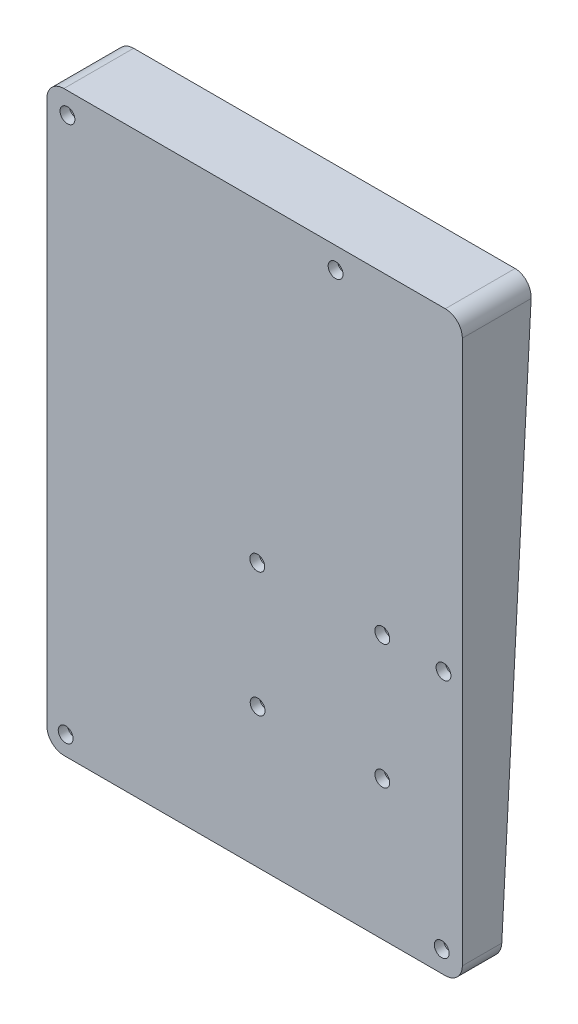
ISO-10303-21;
HEADER;
FILE_DESCRIPTION(('STEP AP214'),'2;1');
FILE_NAME('part.step','',(''),(''),'','','');
FILE_SCHEMA(('AUTOMOTIVE_DESIGN { 1 0 10303 214 1 1 1 1 }'));
ENDSEC;
DATA;
#1=APPLICATION_CONTEXT('core data for automotive mechanical design processes');
#2=APPLICATION_PROTOCOL_DEFINITION('international standard','automotive_design',2000,#1);
#3=PRODUCT_CONTEXT('',#1,'mechanical');
#4=PRODUCT('Part','Part','',(#3));
#5=PRODUCT_RELATED_PRODUCT_CATEGORY('part','',(#4));
#6=PRODUCT_DEFINITION_FORMATION('','',#4);
#7=PRODUCT_DEFINITION_CONTEXT('part definition',#1,'design');
#8=PRODUCT_DEFINITION('design','',#6,#7);
#9=PRODUCT_DEFINITION_SHAPE('','',#8);
#10=(LENGTH_UNIT() NAMED_UNIT(*) SI_UNIT(.MILLI.,.METRE.));
#11=(NAMED_UNIT(*) PLANE_ANGLE_UNIT() SI_UNIT($,.RADIAN.));
#12=(NAMED_UNIT(*) SI_UNIT($,.STERADIAN.) SOLID_ANGLE_UNIT());
#13=UNCERTAINTY_MEASURE_WITH_UNIT(LENGTH_MEASURE(1.E-05),#10,'distance_accuracy_value','');
#14=(GEOMETRIC_REPRESENTATION_CONTEXT(3) GLOBAL_UNCERTAINTY_ASSIGNED_CONTEXT((#13)) GLOBAL_UNIT_ASSIGNED_CONTEXT((#10,
#11,#12)) REPRESENTATION_CONTEXT('',''));
#15=CARTESIAN_POINT('',(0.,0.,0.));
#16=DIRECTION('',(0.,0.,1.));
#17=DIRECTION('',(1.,0.,0.));
#18=AXIS2_PLACEMENT_3D('',#15,#16,#17);
#19=CARTESIAN_POINT('',(0.,-147.224999999975,-4.));
#20=DIRECTION('',(0.,-1.,0.));
#21=DIRECTION('',(0.,0.,-1.));
#22=AXIS2_PLACEMENT_3D('',#19,#20,#21);
#23=PLANE('',#22);
#24=DIRECTION('',(-1.,0.,0.));
#25=VECTOR('',#24,1.);
#26=CARTESIAN_POINT('',(179.27760000005,-147.225000001001,-6.22688410673788));
#27=LINE('',#26,#25);
#28=CARTESIAN_POINT('',(176.527601494175,-147.225000001001,-6.22688410673788));
#29=VERTEX_POINT('',#28);
#30=CARTESIAN_POINT('',(114.897598505875,-147.225000001001,-6.22688410673788));
#31=VERTEX_POINT('',#30);
#32=EDGE_CURVE('E111',#29,#31,#27,.T.);
#33=ORIENTED_EDGE('',*,*,#32,.F.);
#34=DIRECTION('',(0.,0.,1.));
#35=VECTOR('',#34,1.);
#36=CARTESIAN_POINT('',(176.527601494175,-147.224999999975,-4.));
#37=LINE('',#36,#35);
#38=CARTESIAN_POINT('',(176.527601494175,-147.224999999975,0.));
#39=VERTEX_POINT('',#38);
#40=EDGE_CURVE('E138',#29,#39,#37,.T.);
#41=ORIENTED_EDGE('',*,*,#40,.T.);
#42=DIRECTION('',(1.,0.,0.));
#43=VECTOR('',#42,1.);
#44=CARTESIAN_POINT('',(0.,-147.224999999975,0.));
#45=LINE('',#44,#43);
#46=CARTESIAN_POINT('',(114.897598505875,-147.224999999975,0.));
#47=VERTEX_POINT('',#46);
#48=EDGE_CURVE('E195',#47,#39,#45,.T.);
#49=ORIENTED_EDGE('',*,*,#48,.F.);
#50=DIRECTION('',(0.,0.,1.));
#51=VECTOR('',#50,1.);
#52=CARTESIAN_POINT('',(114.897598505875,-147.224999999975,-4.));
#53=LINE('',#52,#51);
#54=EDGE_CURVE('E11',#31,#47,#53,.T.);
#55=ORIENTED_EDGE('',*,*,#54,.F.);
#56=EDGE_LOOP('',(#33,#41,#49,#55));
#57=FACE_BOUND('',#56,.T.);
#58=ADVANCED_FACE('F41',(#57),#23,.T.);
#59=CARTESIAN_POINT('',(114.897598505875,-144.4750014941,-4.));
#60=DIRECTION('',(0.,0.,1.));
#61=DIRECTION('',(1.,0.,0.));
#62=AXIS2_PLACEMENT_3D('',#59,#60,#61);
#63=CYLINDRICAL_SURFACE('',#62,2.74999850587501);
#64=CARTESIAN_POINT('',(114.897598505875,-144.4750014941,-6.37535131441009));
#65=DIRECTION('',(0.,0.0539095964283799,0.998545820387292));
#66=DIRECTION('',(0.,-0.998545820387292,0.0539095964283799));
#67=AXIS2_PLACEMENT_3D('',#64,#65,#66);
#68=ELLIPSE('',#67,2.75400332135826,2.74999850587501);
#69=CARTESIAN_POINT('',(112.1476,-144.4750014941,-6.37535131441009));
#70=VERTEX_POINT('',#69);
#71=EDGE_CURVE('E104',#31,#70,#68,.F.);
#72=ORIENTED_EDGE('',*,*,#71,.F.);
#73=ORIENTED_EDGE('',*,*,#54,.T.);
#74=CARTESIAN_POINT('',(114.897598505875,-144.4750014941,0.));
#75=DIRECTION('',(0.,0.,1.));
#76=DIRECTION('',(1.,0.,0.));
#77=AXIS2_PLACEMENT_3D('',#74,#75,#76);
#78=CIRCLE('',#77,2.74999850587501);
#79=CARTESIAN_POINT('',(112.1476,-144.4750014941,0.));
#80=VERTEX_POINT('',#79);
#81=EDGE_CURVE('E125',#80,#47,#78,.T.);
#82=ORIENTED_EDGE('',*,*,#81,.F.);
#83=DIRECTION('',(0.,0.,1.));
#84=VECTOR('',#83,1.);
#85=CARTESIAN_POINT('',(112.1476,-144.4750014941,-4.));
#86=LINE('',#85,#84);
#87=EDGE_CURVE('E49',#70,#80,#86,.T.);
#88=ORIENTED_EDGE('',*,*,#87,.F.);
#89=EDGE_LOOP('',(#72,#73,#82,#88));
#90=FACE_BOUND('',#89,.T.);
#91=ADVANCED_FACE('F123',(#90),#63,.T.);
#92=CARTESIAN_POINT('',(112.1476,0.,-4.));
#93=DIRECTION('',(-1.,0.,0.));
#94=DIRECTION('',(0.,0.,1.));
#95=AXIS2_PLACEMENT_3D('',#92,#93,#94);
#96=PLANE('',#95);
#97=DIRECTION('',(0.,0.998545820387291,-0.0539095964283799));
#98=VECTOR('',#97,1.);
#99=CARTESIAN_POINT('',(112.1476,-147.225000001001,-6.22688410673788));
#100=LINE('',#99,#98);
#101=CARTESIAN_POINT('',(112.1476,-56.64999850585,-11.116856782413));
#102=VERTEX_POINT('',#101);
#103=EDGE_CURVE('E108',#70,#102,#100,.T.);
#104=ORIENTED_EDGE('',*,*,#103,.F.);
#105=ORIENTED_EDGE('',*,*,#87,.T.);
#106=DIRECTION('',(0.,-1.,0.));
#107=VECTOR('',#106,1.);
#108=CARTESIAN_POINT('',(112.1476,0.,0.));
#109=LINE('',#108,#107);
#110=CARTESIAN_POINT('',(112.1476,-56.64999850585,0.));
#111=VERTEX_POINT('',#110);
#112=EDGE_CURVE('E213',#111,#80,#109,.T.);
#113=ORIENTED_EDGE('',*,*,#112,.F.);
#114=DIRECTION('',(0.,0.,1.));
#115=VECTOR('',#114,1.);
#116=CARTESIAN_POINT('',(112.1476,-56.64999850585,-4.));
#117=LINE('',#116,#115);
#118=EDGE_CURVE('E121',#102,#111,#117,.T.);
#119=ORIENTED_EDGE('',*,*,#118,.F.);
#120=EDGE_LOOP('',(#104,#105,#113,#119));
#121=FACE_BOUND('',#120,.T.);
#122=ADVANCED_FACE('F118',(#121),#96,.T.);
#123=CARTESIAN_POINT('',(114.89759850585,-56.64999850585,-4.));
#124=DIRECTION('',(0.,0.,1.));
#125=DIRECTION('',(1.,0.,0.));
#126=AXIS2_PLACEMENT_3D('',#123,#124,#125);
#127=CYLINDRICAL_SURFACE('',#126,2.74999850585);
#128=CARTESIAN_POINT('',(114.89759850585,-56.64999850585,-11.116856782413));
#129=DIRECTION('',(0.,0.0539095964283799,0.998545820387292));
#130=DIRECTION('',(0.,-0.998545820387292,0.0539095964283799));
#131=AXIS2_PLACEMENT_3D('',#128,#129,#130);
#132=ELLIPSE('',#131,2.75400332133322,2.74999850585);
#133=CARTESIAN_POINT('',(114.89759850585,-53.9,-11.2653239900285));
#134=VERTEX_POINT('',#133);
#135=EDGE_CURVE('E114',#102,#134,#132,.F.);
#136=ORIENTED_EDGE('',*,*,#135,.F.);
#137=ORIENTED_EDGE('',*,*,#118,.T.);
#138=CARTESIAN_POINT('',(114.89759850585,-56.64999850585,0.));
#139=DIRECTION('',(0.,0.,1.));
#140=DIRECTION('',(1.,0.,0.));
#141=AXIS2_PLACEMENT_3D('',#138,#139,#140);
#142=CIRCLE('',#141,2.74999850585);
#143=CARTESIAN_POINT('',(114.89759850585,-53.9,0.));
#144=VERTEX_POINT('',#143);
#145=EDGE_CURVE('E210',#144,#111,#142,.T.);
#146=ORIENTED_EDGE('',*,*,#145,.F.);
#147=DIRECTION('',(0.,0.,1.));
#148=VECTOR('',#147,1.);
#149=CARTESIAN_POINT('',(114.89759850585,-53.9,-4.));
#150=LINE('',#149,#148);
#151=EDGE_CURVE('E127',#134,#144,#150,.T.);
#152=ORIENTED_EDGE('',*,*,#151,.F.);
#153=EDGE_LOOP('',(#136,#137,#146,#152));
#154=FACE_BOUND('',#153,.T.);
#155=ADVANCED_FACE('F220',(#154),#127,.T.);
#156=CARTESIAN_POINT('',(3.64114815738712E-13,-53.9000000000008,-4.));
#157=DIRECTION('',(0.,-1.,0.));
#158=DIRECTION('',(1.,0.,0.));
#159=AXIS2_PLACEMENT_3D('',#156,#157,#158);
#160=PLANE('',#159);
#161=DIRECTION('',(0.,0.,1.));
#162=VECTOR('',#161,1.);
#163=CARTESIAN_POINT('',(176.527562229544,-53.8999999999996,-4.));
#164=LINE('',#163,#162);
#165=CARTESIAN_POINT('',(176.527562229544,-53.8999999999996,-11.2653239900285));
#166=VERTEX_POINT('',#165);
#167=CARTESIAN_POINT('',(176.527562229544,-53.8999999999996,0.));
#168=VERTEX_POINT('',#167);
#169=EDGE_CURVE('E132',#166,#168,#164,.T.);
#170=ORIENTED_EDGE('',*,*,#169,.F.);
#171=DIRECTION('',(-1.,0.,0.));
#172=VECTOR('',#171,1.);
#173=CARTESIAN_POINT('',(3.61465079447583E-13,-53.9000000000008,-11.2653239900285));
#174=LINE('',#173,#172);
#175=EDGE_CURVE('E222',#166,#134,#174,.T.);
#176=ORIENTED_EDGE('',*,*,#175,.T.);
#177=ORIENTED_EDGE('',*,*,#151,.T.);
#178=DIRECTION('',(1.,0.,0.));
#179=VECTOR('',#178,1.);
#180=CARTESIAN_POINT('',(3.64114815738712E-13,-53.9000000000008,0.));
#181=LINE('',#180,#179);
#182=EDGE_CURVE('E207',#144,#168,#181,.T.);
#183=ORIENTED_EDGE('',*,*,#182,.T.);
#184=EDGE_LOOP('',(#170,#176,#177,#183));
#185=FACE_BOUND('',#184,.T.);
#186=ADVANCED_FACE('F302',(#185),#160,.F.);
#187=CARTESIAN_POINT('',(176.527562229544,-56.6500377705061,-4.));
#188=DIRECTION('',(0.,0.,1.));
#189=DIRECTION('',(1.,0.,0.));
#190=AXIS2_PLACEMENT_3D('',#187,#188,#189);
#191=CYLINDRICAL_SURFACE('',#190,2.75003777050629);
#192=CARTESIAN_POINT('',(176.527562229544,-56.6500377705061,-11.1168546625887));
#193=DIRECTION('',(0.,0.0539095964283799,0.998545820387292));
#194=DIRECTION('',(0.,-0.998545820387292,0.0539095964283799));
#195=AXIS2_PLACEMENT_3D('',#192,#193,#194);
#196=ELLIPSE('',#195,2.75404264317052,2.75003777050629);
#197=CARTESIAN_POINT('',(179.27760000005,-56.6500377705062,-11.1168546625887));
#198=VERTEX_POINT('',#197);
#199=EDGE_CURVE('E224',#166,#198,#196,.F.);
#200=ORIENTED_EDGE('',*,*,#199,.F.);
#201=ORIENTED_EDGE('',*,*,#169,.T.);
#202=CARTESIAN_POINT('',(176.527562229544,-56.6500377705061,0.));
#203=DIRECTION('',(0.,0.,1.));
#204=DIRECTION('',(1.,0.,0.));
#205=AXIS2_PLACEMENT_3D('',#202,#203,#204);
#206=CIRCLE('',#205,2.75003777050629);
#207=CARTESIAN_POINT('',(179.27760000005,-56.6500377705062,0.));
#208=VERTEX_POINT('',#207);
#209=EDGE_CURVE('E204',#208,#168,#206,.T.);
#210=ORIENTED_EDGE('',*,*,#209,.F.);
#211=DIRECTION('',(0.,0.,1.));
#212=VECTOR('',#211,1.);
#213=CARTESIAN_POINT('',(179.27760000005,-56.6500377705062,-4.));
#214=LINE('',#213,#212);
#215=EDGE_CURVE('E134',#198,#208,#214,.T.);
#216=ORIENTED_EDGE('',*,*,#215,.F.);
#217=EDGE_LOOP('',(#200,#201,#210,#216));
#218=FACE_BOUND('',#217,.T.);
#219=ADVANCED_FACE('F299',(#218),#191,.T.);
#220=CARTESIAN_POINT('',(179.27760000005,0.,-4.));
#221=DIRECTION('',(1.,0.,0.));
#222=DIRECTION('',(0.,1.,0.));
#223=AXIS2_PLACEMENT_3D('',#220,#221,#222);
#224=PLANE('',#223);
#225=DIRECTION('',(0.,0.998545820387291,-0.0539095964283799));
#226=VECTOR('',#225,1.);
#227=CARTESIAN_POINT('',(179.27760000005,-147.225000001001,-6.22688410673788));
#228=LINE('',#227,#226);
#229=CARTESIAN_POINT('',(179.27760000005,-144.4750014941,-6.37535131441009));
#230=VERTEX_POINT('',#229);
#231=EDGE_CURVE('E57',#230,#198,#228,.T.);
#232=ORIENTED_EDGE('',*,*,#231,.T.);
#233=ORIENTED_EDGE('',*,*,#215,.T.);
#234=DIRECTION('',(0.,1.,0.));
#235=VECTOR('',#234,1.);
#236=CARTESIAN_POINT('',(179.27760000005,0.,0.));
#237=LINE('',#236,#235);
#238=CARTESIAN_POINT('',(179.27760000005,-144.4750014941,0.));
#239=VERTEX_POINT('',#238);
#240=EDGE_CURVE('E201',#239,#208,#237,.T.);
#241=ORIENTED_EDGE('',*,*,#240,.F.);
#242=DIRECTION('',(0.,0.,1.));
#243=VECTOR('',#242,1.);
#244=CARTESIAN_POINT('',(179.27760000005,-144.4750014941,-4.));
#245=LINE('',#244,#243);
#246=EDGE_CURVE('E136',#230,#239,#245,.T.);
#247=ORIENTED_EDGE('',*,*,#246,.F.);
#248=EDGE_LOOP('',(#232,#233,#241,#247));
#249=FACE_BOUND('',#248,.T.);
#250=ADVANCED_FACE('F295',(#249),#224,.T.);
#251=CARTESIAN_POINT('',(176.527601494175,-144.4750014941,-4.));
#252=DIRECTION('',(0.,0.,1.));
#253=DIRECTION('',(1.,0.,0.));
#254=AXIS2_PLACEMENT_3D('',#251,#252,#253);
#255=CYLINDRICAL_SURFACE('',#254,2.749998505875);
#256=CARTESIAN_POINT('',(176.527601494175,-144.4750014941,-6.37535131441009));
#257=DIRECTION('',(0.,0.0539095964283799,0.998545820387292));
#258=DIRECTION('',(0.,-0.998545820387292,0.0539095964283799));
#259=AXIS2_PLACEMENT_3D('',#256,#257,#258);
#260=ELLIPSE('',#259,2.75400332135825,2.749998505875);
#261=EDGE_CURVE('E290',#230,#29,#260,.F.);
#262=ORIENTED_EDGE('',*,*,#261,.F.);
#263=ORIENTED_EDGE('',*,*,#246,.T.);
#264=CARTESIAN_POINT('',(176.527601494175,-144.4750014941,0.));
#265=DIRECTION('',(0.,0.,1.));
#266=DIRECTION('',(1.,0.,0.));
#267=AXIS2_PLACEMENT_3D('',#264,#265,#266);
#268=CIRCLE('',#267,2.749998505875);
#269=EDGE_CURVE('E198',#39,#239,#268,.T.);
#270=ORIENTED_EDGE('',*,*,#269,.F.);
#271=ORIENTED_EDGE('',*,*,#40,.F.);
#272=EDGE_LOOP('',(#262,#263,#270,#271));
#273=FACE_BOUND('',#272,.T.);
#274=ADVANCED_FACE('F262',(#273),#255,.T.);
#275=CARTESIAN_POINT('',(0.,0.,0.));
#276=DIRECTION('',(0.,0.,1.));
#277=DIRECTION('',(1.,0.,0.));
#278=AXIS2_PLACEMENT_3D('',#275,#276,#277);
#279=PLANE('',#278);
#280=CARTESIAN_POINT('',(158.8,-57.35,0.));
#281=DIRECTION('',(0.,0.,1.));
#282=DIRECTION('',(1.,0.,0.));
#283=AXIS2_PLACEMENT_3D('',#280,#281,#282);
#284=CIRCLE('',#283,1.20000000000001);
#285=CARTESIAN_POINT('',(160.,-57.35,0.));
#286=VERTEX_POINT('',#285);
#287=EDGE_CURVE('E179',#286,#286,#284,.T.);
#288=ORIENTED_EDGE('',*,*,#287,.F.);
#289=EDGE_LOOP('',(#288));
#290=FACE_BOUND('',#289,.T.);
#291=CARTESIAN_POINT('',(115.185,-144.135,0.));
#292=DIRECTION('',(0.,0.,1.));
#293=DIRECTION('',(1.,0.,0.));
#294=AXIS2_PLACEMENT_3D('',#291,#292,#293);
#295=CIRCLE('',#294,1.2);
#296=CARTESIAN_POINT('',(116.385,-144.135,0.));
#297=VERTEX_POINT('',#296);
#298=EDGE_CURVE('E183',#297,#297,#295,.T.);
#299=ORIENTED_EDGE('',*,*,#298,.F.);
#300=EDGE_LOOP('',(#299));
#301=FACE_BOUND('',#300,.T.);
#302=CARTESIAN_POINT('',(175.95,-143.8,0.));
#303=DIRECTION('',(0.,0.,1.));
#304=DIRECTION('',(1.,0.,0.));
#305=AXIS2_PLACEMENT_3D('',#302,#303,#304);
#306=CIRCLE('',#305,1.20000000000002);
#307=CARTESIAN_POINT('',(177.15,-143.8,0.));
#308=VERTEX_POINT('',#307);
#309=EDGE_CURVE('E186',#308,#308,#306,.T.);
#310=ORIENTED_EDGE('',*,*,#309,.F.);
#311=EDGE_LOOP('',(#310));
#312=FACE_BOUND('',#311,.T.);
#313=CARTESIAN_POINT('',(176.235,-104.807031,0.));
#314=DIRECTION('',(0.,0.,1.));
#315=DIRECTION('',(1.,0.,0.));
#316=AXIS2_PLACEMENT_3D('',#313,#314,#315);
#317=CIRCLE('',#316,1.20000000000002);
#318=CARTESIAN_POINT('',(177.435,-104.807031,0.));
#319=VERTEX_POINT('',#318);
#320=EDGE_CURVE('E189',#319,#319,#317,.T.);
#321=ORIENTED_EDGE('',*,*,#320,.F.);
#322=EDGE_LOOP('',(#321));
#323=FACE_BOUND('',#322,.T.);
#324=CARTESIAN_POINT('',(146.15,-104.625,0.));
#325=DIRECTION('',(0.,0.,1.));
#326=DIRECTION('',(1.,0.,0.));
#327=AXIS2_PLACEMENT_3D('',#324,#325,#326);
#328=CIRCLE('',#327,1.20000000000002);
#329=CARTESIAN_POINT('',(147.35,-104.625,0.));
#330=VERTEX_POINT('',#329);
#331=EDGE_CURVE('E192',#330,#330,#328,.T.);
#332=ORIENTED_EDGE('',*,*,#331,.F.);
#333=EDGE_LOOP('',(#332));
#334=FACE_BOUND('',#333,.T.);
#335=CARTESIAN_POINT('',(146.2,-124.725,0.));
#336=DIRECTION('',(0.,0.,1.));
#337=DIRECTION('',(1.,0.,0.));
#338=AXIS2_PLACEMENT_3D('',#335,#336,#337);
#339=CIRCLE('',#338,1.20000000000002);
#340=CARTESIAN_POINT('',(147.4,-124.725,0.));
#341=VERTEX_POINT('',#340);
#342=EDGE_CURVE('E175',#341,#341,#339,.T.);
#343=ORIENTED_EDGE('',*,*,#342,.F.);
#344=EDGE_LOOP('',(#343));
#345=FACE_BOUND('',#344,.T.);
#346=CARTESIAN_POINT('',(166.35,-124.725,0.));
#347=DIRECTION('',(0.,0.,1.));
#348=DIRECTION('',(1.,0.,0.));
#349=AXIS2_PLACEMENT_3D('',#346,#347,#348);
#350=CIRCLE('',#349,1.20000000000002);
#351=CARTESIAN_POINT('',(167.55,-124.725,0.));
#352=VERTEX_POINT('',#351);
#353=EDGE_CURVE('E170',#352,#352,#350,.T.);
#354=ORIENTED_EDGE('',*,*,#353,.F.);
#355=EDGE_LOOP('',(#354));
#356=FACE_BOUND('',#355,.T.);
#357=CARTESIAN_POINT('',(166.35,-104.625,0.));
#358=DIRECTION('',(0.,0.,1.));
#359=DIRECTION('',(1.,0.,0.));
#360=AXIS2_PLACEMENT_3D('',#357,#358,#359);
#361=CIRCLE('',#360,1.20000000000002);
#362=CARTESIAN_POINT('',(167.55,-104.625,0.));
#363=VERTEX_POINT('',#362);
#364=EDGE_CURVE('E166',#363,#363,#361,.T.);
#365=ORIENTED_EDGE('',*,*,#364,.F.);
#366=EDGE_LOOP('',(#365));
#367=FACE_BOUND('',#366,.T.);
#368=CARTESIAN_POINT('',(115.475,-57.35,0.));
#369=DIRECTION('',(0.,0.,1.));
#370=DIRECTION('',(1.,0.,0.));
#371=AXIS2_PLACEMENT_3D('',#368,#369,#370);
#372=CIRCLE('',#371,1.2);
#373=CARTESIAN_POINT('',(116.675,-57.35,0.));
#374=VERTEX_POINT('',#373);
#375=EDGE_CURVE('E182',#374,#374,#372,.T.);
#376=ORIENTED_EDGE('',*,*,#375,.F.);
#377=EDGE_LOOP('',(#376));
#378=FACE_BOUND('',#377,.T.);
#379=ORIENTED_EDGE('',*,*,#48,.T.);
#380=ORIENTED_EDGE('',*,*,#269,.T.);
#381=ORIENTED_EDGE('',*,*,#240,.T.);
#382=ORIENTED_EDGE('',*,*,#209,.T.);
#383=ORIENTED_EDGE('',*,*,#182,.F.);
#384=ORIENTED_EDGE('',*,*,#145,.T.);
#385=ORIENTED_EDGE('',*,*,#112,.T.);
#386=ORIENTED_EDGE('',*,*,#81,.T.);
#387=EDGE_LOOP('',(#379,#380,#381,#382,#383,#384,#385,#386));
#388=FACE_BOUND('',#387,.T.);
#389=ADVANCED_FACE('F215',(#290,#301,#312,#323,#334,#345,#356,#367,#378,#388),#279,.T.);
#390=CARTESIAN_POINT('',(115.475,-57.35,-4.));
#391=DIRECTION('',(0.,0.,1.));
#392=DIRECTION('',(1.,0.,0.));
#393=AXIS2_PLACEMENT_3D('',#390,#391,#392);
#394=CYLINDRICAL_SURFACE('',#393,1.2);
#395=CARTESIAN_POINT('',(115.475,-57.35,-1.5));
#396=DIRECTION('',(0.,0.,1.));
#397=DIRECTION('',(1.,0.,0.));
#398=AXIS2_PLACEMENT_3D('',#395,#396,#397);
#399=CIRCLE('',#398,1.2);
#400=CARTESIAN_POINT('',(116.675,-57.35,-1.5));
#401=VERTEX_POINT('',#400);
#402=EDGE_CURVE('E164',#401,#401,#399,.F.);
#403=ORIENTED_EDGE('',*,*,#402,.T.);
#404=EDGE_LOOP('',(#403));
#405=FACE_BOUND('',#404,.T.);
#406=ORIENTED_EDGE('',*,*,#375,.T.);
#407=EDGE_LOOP('',(#406));
#408=FACE_BOUND('',#407,.T.);
#409=ADVANCED_FACE('F261',(#405,#408),#394,.F.);
#410=CARTESIAN_POINT('',(166.35,-104.625,-4.));
#411=DIRECTION('',(0.,0.,1.));
#412=DIRECTION('',(1.,0.,0.));
#413=AXIS2_PLACEMENT_3D('',#410,#411,#412);
#414=CYLINDRICAL_SURFACE('',#413,1.20000000000002);
#415=CARTESIAN_POINT('',(166.35,-104.625,-1.5));
#416=DIRECTION('',(0.,0.,1.));
#417=DIRECTION('',(1.,0.,0.));
#418=AXIS2_PLACEMENT_3D('',#415,#416,#417);
#419=CIRCLE('',#418,1.20000000000002);
#420=CARTESIAN_POINT('',(167.55,-104.625,-1.5));
#421=VERTEX_POINT('',#420);
#422=EDGE_CURVE('E162',#421,#421,#419,.F.);
#423=ORIENTED_EDGE('',*,*,#422,.T.);
#424=EDGE_LOOP('',(#423));
#425=FACE_BOUND('',#424,.T.);
#426=ORIENTED_EDGE('',*,*,#364,.T.);
#427=EDGE_LOOP('',(#426));
#428=FACE_BOUND('',#427,.T.);
#429=ADVANCED_FACE('F271',(#425,#428),#414,.F.);
#430=CARTESIAN_POINT('',(166.35,-124.725,-4.));
#431=DIRECTION('',(0.,0.,1.));
#432=DIRECTION('',(1.,0.,0.));
#433=AXIS2_PLACEMENT_3D('',#430,#431,#432);
#434=CYLINDRICAL_SURFACE('',#433,1.20000000000002);
#435=CARTESIAN_POINT('',(166.35,-124.725,-1.5));
#436=DIRECTION('',(0.,0.,1.));
#437=DIRECTION('',(1.,0.,0.));
#438=AXIS2_PLACEMENT_3D('',#435,#436,#437);
#439=CIRCLE('',#438,1.20000000000002);
#440=CARTESIAN_POINT('',(167.55,-124.725,-1.5));
#441=VERTEX_POINT('',#440);
#442=EDGE_CURVE('E159',#441,#441,#439,.F.);
#443=ORIENTED_EDGE('',*,*,#442,.T.);
#444=EDGE_LOOP('',(#443));
#445=FACE_BOUND('',#444,.T.);
#446=ORIENTED_EDGE('',*,*,#353,.T.);
#447=EDGE_LOOP('',(#446));
#448=FACE_BOUND('',#447,.T.);
#449=ADVANCED_FACE('F276',(#445,#448),#434,.F.);
#450=CARTESIAN_POINT('',(146.2,-124.725,-4.));
#451=DIRECTION('',(0.,0.,1.));
#452=DIRECTION('',(1.,0.,0.));
#453=AXIS2_PLACEMENT_3D('',#450,#451,#452);
#454=CYLINDRICAL_SURFACE('',#453,1.20000000000002);
#455=CARTESIAN_POINT('',(146.2,-124.725,-1.5));
#456=DIRECTION('',(0.,0.,1.));
#457=DIRECTION('',(1.,0.,0.));
#458=AXIS2_PLACEMENT_3D('',#455,#456,#457);
#459=CIRCLE('',#458,1.20000000000002);
#460=CARTESIAN_POINT('',(147.4,-124.725,-1.5));
#461=VERTEX_POINT('',#460);
#462=EDGE_CURVE('E156',#461,#461,#459,.F.);
#463=ORIENTED_EDGE('',*,*,#462,.T.);
#464=EDGE_LOOP('',(#463));
#465=FACE_BOUND('',#464,.T.);
#466=ORIENTED_EDGE('',*,*,#342,.T.);
#467=EDGE_LOOP('',(#466));
#468=FACE_BOUND('',#467,.T.);
#469=ADVANCED_FACE('F257',(#465,#468),#454,.F.);
#470=CARTESIAN_POINT('',(146.15,-104.625,-4.));
#471=DIRECTION('',(0.,0.,1.));
#472=DIRECTION('',(1.,0.,0.));
#473=AXIS2_PLACEMENT_3D('',#470,#471,#472);
#474=CYLINDRICAL_SURFACE('',#473,1.20000000000002);
#475=CARTESIAN_POINT('',(146.15,-104.625,-1.5));
#476=DIRECTION('',(0.,0.,1.));
#477=DIRECTION('',(1.,0.,0.));
#478=AXIS2_PLACEMENT_3D('',#475,#476,#477);
#479=CIRCLE('',#478,1.20000000000002);
#480=CARTESIAN_POINT('',(147.35,-104.625,-1.5));
#481=VERTEX_POINT('',#480);
#482=EDGE_CURVE('E153',#481,#481,#479,.F.);
#483=ORIENTED_EDGE('',*,*,#482,.T.);
#484=EDGE_LOOP('',(#483));
#485=FACE_BOUND('',#484,.T.);
#486=ORIENTED_EDGE('',*,*,#331,.T.);
#487=EDGE_LOOP('',(#486));
#488=FACE_BOUND('',#487,.T.);
#489=ADVANCED_FACE('F356',(#485,#488),#474,.F.);
#490=CARTESIAN_POINT('',(176.235,-104.807031,-4.));
#491=DIRECTION('',(0.,0.,1.));
#492=DIRECTION('',(1.,0.,0.));
#493=AXIS2_PLACEMENT_3D('',#490,#491,#492);
#494=CYLINDRICAL_SURFACE('',#493,1.20000000000002);
#495=CARTESIAN_POINT('',(176.235,-104.807031,-1.5));
#496=DIRECTION('',(0.,0.,1.));
#497=DIRECTION('',(1.,0.,0.));
#498=AXIS2_PLACEMENT_3D('',#495,#496,#497);
#499=CIRCLE('',#498,1.20000000000002);
#500=CARTESIAN_POINT('',(177.435,-104.807031,-1.5));
#501=VERTEX_POINT('',#500);
#502=EDGE_CURVE('E150',#501,#501,#499,.F.);
#503=ORIENTED_EDGE('',*,*,#502,.T.);
#504=EDGE_LOOP('',(#503));
#505=FACE_BOUND('',#504,.T.);
#506=ORIENTED_EDGE('',*,*,#320,.T.);
#507=EDGE_LOOP('',(#506));
#508=FACE_BOUND('',#507,.T.);
#509=ADVANCED_FACE('F359',(#505,#508),#494,.F.);
#510=CARTESIAN_POINT('',(175.95,-143.8,-4.));
#511=DIRECTION('',(0.,0.,1.));
#512=DIRECTION('',(1.,0.,0.));
#513=AXIS2_PLACEMENT_3D('',#510,#511,#512);
#514=CYLINDRICAL_SURFACE('',#513,1.20000000000002);
#515=CARTESIAN_POINT('',(175.95,-143.8,-1.5));
#516=DIRECTION('',(0.,0.,1.));
#517=DIRECTION('',(1.,0.,0.));
#518=AXIS2_PLACEMENT_3D('',#515,#516,#517);
#519=CIRCLE('',#518,1.20000000000002);
#520=CARTESIAN_POINT('',(177.15,-143.8,-1.5));
#521=VERTEX_POINT('',#520);
#522=EDGE_CURVE('E147',#521,#521,#519,.F.);
#523=ORIENTED_EDGE('',*,*,#522,.T.);
#524=EDGE_LOOP('',(#523));
#525=FACE_BOUND('',#524,.T.);
#526=ORIENTED_EDGE('',*,*,#309,.T.);
#527=EDGE_LOOP('',(#526));
#528=FACE_BOUND('',#527,.T.);
#529=ADVANCED_FACE('F375',(#525,#528),#514,.F.);
#530=CARTESIAN_POINT('',(115.185,-144.135,-4.));
#531=DIRECTION('',(0.,0.,1.));
#532=DIRECTION('',(1.,0.,0.));
#533=AXIS2_PLACEMENT_3D('',#530,#531,#532);
#534=CYLINDRICAL_SURFACE('',#533,1.2);
#535=CARTESIAN_POINT('',(115.185,-144.135,-1.5));
#536=DIRECTION('',(0.,0.,1.));
#537=DIRECTION('',(1.,0.,0.));
#538=AXIS2_PLACEMENT_3D('',#535,#536,#537);
#539=CIRCLE('',#538,1.2);
#540=CARTESIAN_POINT('',(116.385,-144.135,-1.5));
#541=VERTEX_POINT('',#540);
#542=EDGE_CURVE('E143',#541,#541,#539,.F.);
#543=ORIENTED_EDGE('',*,*,#542,.T.);
#544=EDGE_LOOP('',(#543));
#545=FACE_BOUND('',#544,.T.);
#546=ORIENTED_EDGE('',*,*,#298,.T.);
#547=EDGE_LOOP('',(#546));
#548=FACE_BOUND('',#547,.T.);
#549=ADVANCED_FACE('F371',(#545,#548),#534,.F.);
#550=CARTESIAN_POINT('',(158.8,-57.35,-4.));
#551=DIRECTION('',(0.,0.,1.));
#552=DIRECTION('',(1.,0.,0.));
#553=AXIS2_PLACEMENT_3D('',#550,#551,#552);
#554=CYLINDRICAL_SURFACE('',#553,1.20000000000001);
#555=CARTESIAN_POINT('',(158.8,-57.35,-1.5));
#556=DIRECTION('',(0.,0.,1.));
#557=DIRECTION('',(1.,0.,0.));
#558=AXIS2_PLACEMENT_3D('',#555,#556,#557);
#559=CIRCLE('',#558,1.20000000000001);
#560=CARTESIAN_POINT('',(160.,-57.35,-1.5));
#561=VERTEX_POINT('',#560);
#562=EDGE_CURVE('E140',#561,#561,#559,.F.);
#563=ORIENTED_EDGE('',*,*,#562,.T.);
#564=EDGE_LOOP('',(#563));
#565=FACE_BOUND('',#564,.T.);
#566=ORIENTED_EDGE('',*,*,#287,.T.);
#567=EDGE_LOOP('',(#566));
#568=FACE_BOUND('',#567,.T.);
#569=ADVANCED_FACE('F367',(#565,#568),#554,.F.);
#570=CARTESIAN_POINT('',(158.8,-57.35,-1.5));
#571=DIRECTION('',(0.,0.,1.));
#572=DIRECTION('',(1.,0.,0.));
#573=AXIS2_PLACEMENT_3D('',#570,#571,#572);
#574=PLANE('',#573);
#575=CARTESIAN_POINT('',(158.8,-57.35,-1.5));
#576=DIRECTION('',(0.,0.,1.));
#577=DIRECTION('',(1.,0.,0.));
#578=AXIS2_PLACEMENT_3D('',#575,#576,#577);
#579=CIRCLE('',#578,2.);
#580=CARTESIAN_POINT('',(160.8,-57.35,-1.5));
#581=VERTEX_POINT('',#580);
#582=EDGE_CURVE('E240',#581,#581,#579,.T.);
#583=ORIENTED_EDGE('',*,*,#582,.F.);
#584=EDGE_LOOP('',(#583));
#585=FACE_BOUND('',#584,.T.);
#586=ORIENTED_EDGE('',*,*,#562,.F.);
#587=EDGE_LOOP('',(#586));
#588=FACE_BOUND('',#587,.T.);
#589=ADVANCED_FACE('F370',(#585,#588),#574,.F.);
#590=CARTESIAN_POINT('',(158.8,-57.35,-1.5));
#591=DIRECTION('',(0.,0.,-1.));
#592=DIRECTION('',(-1.,0.,0.));
#593=AXIS2_PLACEMENT_3D('',#590,#591,#592);
#594=CYLINDRICAL_SURFACE('',#593,2.);
#595=CARTESIAN_POINT('',(158.8,-57.35,-11.0790650283659));
#596=DIRECTION('',(0.,0.0539095964283799,0.998545820387292));
#597=DIRECTION('',(0.,0.998545820387292,-0.0539095964283799));
#598=AXIS2_PLACEMENT_3D('',#595,#596,#597);
#599=ELLIPSE('',#598,2.00291259466119,2.);
#600=CARTESIAN_POINT('',(158.8,-55.35,-11.1870412380254));
#601=VERTEX_POINT('',#600);
#602=EDGE_CURVE('E303',#601,#601,#599,.T.);
#603=ORIENTED_EDGE('',*,*,#602,.F.);
#604=EDGE_LOOP('',(#603));
#605=FACE_BOUND('',#604,.T.);
#606=ORIENTED_EDGE('',*,*,#582,.T.);
#607=EDGE_LOOP('',(#606));
#608=FACE_BOUND('',#607,.T.);
#609=ADVANCED_FACE('F418',(#605,#608),#594,.F.);
#610=CARTESIAN_POINT('',(115.185,-144.135,-1.5));
#611=DIRECTION('',(0.,0.,1.));
#612=DIRECTION('',(1.,0.,0.));
#613=AXIS2_PLACEMENT_3D('',#610,#611,#612);
#614=PLANE('',#613);
#615=CARTESIAN_POINT('',(115.185,-144.135,-1.5));
#616=DIRECTION('',(0.,0.,1.));
#617=DIRECTION('',(1.,0.,0.));
#618=AXIS2_PLACEMENT_3D('',#615,#616,#617);
#619=CIRCLE('',#618,2.);
#620=CARTESIAN_POINT('',(117.185,-144.135,-1.5));
#621=VERTEX_POINT('',#620);
#622=EDGE_CURVE('E243',#621,#621,#619,.T.);
#623=ORIENTED_EDGE('',*,*,#622,.F.);
#624=EDGE_LOOP('',(#623));
#625=FACE_BOUND('',#624,.T.);
#626=ORIENTED_EDGE('',*,*,#542,.F.);
#627=EDGE_LOOP('',(#626));
#628=FACE_BOUND('',#627,.T.);
#629=ADVANCED_FACE('F415',(#625,#628),#614,.F.);
#630=CARTESIAN_POINT('',(115.185,-144.135,-1.5));
#631=DIRECTION('',(0.,0.,-1.));
#632=DIRECTION('',(-1.,0.,0.));
#633=AXIS2_PLACEMENT_3D('',#630,#631,#632);
#634=CYLINDRICAL_SURFACE('',#633,2.);
#635=CARTESIAN_POINT('',(115.185,-144.135,-6.39370735071584));
#636=DIRECTION('',(0.,0.0539095964283799,0.998545820387292));
#637=DIRECTION('',(0.,0.998545820387292,-0.0539095964283799));
#638=AXIS2_PLACEMENT_3D('',#635,#636,#637);
#639=ELLIPSE('',#638,2.00291259466119,2.);
#640=CARTESIAN_POINT('',(115.185,-142.135,-6.50168356037534));
#641=VERTEX_POINT('',#640);
#642=EDGE_CURVE('E308',#641,#641,#639,.T.);
#643=ORIENTED_EDGE('',*,*,#642,.F.);
#644=EDGE_LOOP('',(#643));
#645=FACE_BOUND('',#644,.T.);
#646=ORIENTED_EDGE('',*,*,#622,.T.);
#647=EDGE_LOOP('',(#646));
#648=FACE_BOUND('',#647,.T.);
#649=ADVANCED_FACE('F409',(#645,#648),#634,.F.);
#650=CARTESIAN_POINT('',(175.95,-143.8,-1.5));
#651=DIRECTION('',(0.,0.,1.));
#652=DIRECTION('',(1.,0.,0.));
#653=AXIS2_PLACEMENT_3D('',#650,#651,#652);
#654=PLANE('',#653);
#655=CARTESIAN_POINT('',(175.95,-143.8,-1.5));
#656=DIRECTION('',(0.,0.,1.));
#657=DIRECTION('',(1.,0.,0.));
#658=AXIS2_PLACEMENT_3D('',#655,#656,#657);
#659=CIRCLE('',#658,2.);
#660=CARTESIAN_POINT('',(177.95,-143.8,-1.5));
#661=VERTEX_POINT('',#660);
#662=EDGE_CURVE('E246',#661,#661,#659,.T.);
#663=ORIENTED_EDGE('',*,*,#662,.F.);
#664=EDGE_LOOP('',(#663));
#665=FACE_BOUND('',#664,.T.);
#666=ORIENTED_EDGE('',*,*,#522,.F.);
#667=EDGE_LOOP('',(#666));
#668=FACE_BOUND('',#667,.T.);
#669=ADVANCED_FACE('F401',(#665,#668),#654,.F.);
#670=CARTESIAN_POINT('',(175.95,-143.8,-1.5));
#671=DIRECTION('',(0.,0.,-1.));
#672=DIRECTION('',(-1.,0.,0.));
#673=AXIS2_PLACEMENT_3D('',#670,#671,#672);
#674=CYLINDRICAL_SURFACE('',#673,2.);
#675=CARTESIAN_POINT('',(175.95,-143.8,-6.41179336583381));
#676=DIRECTION('',(0.,0.0539095964283799,0.998545820387292));
#677=DIRECTION('',(0.,0.998545820387292,-0.0539095964283799));
#678=AXIS2_PLACEMENT_3D('',#675,#676,#677);
#679=ELLIPSE('',#678,2.00291259466119,2.);
#680=CARTESIAN_POINT('',(175.95,-141.8,-6.51976957549331));
#681=VERTEX_POINT('',#680);
#682=EDGE_CURVE('E311',#681,#681,#679,.T.);
#683=ORIENTED_EDGE('',*,*,#682,.F.);
#684=EDGE_LOOP('',(#683));
#685=FACE_BOUND('',#684,.T.);
#686=ORIENTED_EDGE('',*,*,#662,.T.);
#687=EDGE_LOOP('',(#686));
#688=FACE_BOUND('',#687,.T.);
#689=ADVANCED_FACE('F393',(#685,#688),#674,.F.);
#690=CARTESIAN_POINT('',(176.235,-104.807031,-1.5));
#691=DIRECTION('',(0.,0.,1.));
#692=DIRECTION('',(1.,0.,0.));
#693=AXIS2_PLACEMENT_3D('',#690,#691,#692);
#694=PLANE('',#693);
#695=CARTESIAN_POINT('',(176.235,-104.807031,-1.5));
#696=DIRECTION('',(0.,0.,1.));
#697=DIRECTION('',(1.,0.,0.));
#698=AXIS2_PLACEMENT_3D('',#695,#696,#697);
#699=CIRCLE('',#698,2.);
#700=CARTESIAN_POINT('',(178.235,-104.807031,-1.5));
#701=VERTEX_POINT('',#700);
#702=EDGE_CURVE('E231',#701,#701,#699,.T.);
#703=ORIENTED_EDGE('',*,*,#702,.F.);
#704=EDGE_LOOP('',(#703));
#705=FACE_BOUND('',#704,.T.);
#706=ORIENTED_EDGE('',*,*,#502,.F.);
#707=EDGE_LOOP('',(#706));
#708=FACE_BOUND('',#707,.T.);
#709=ADVANCED_FACE('F353',(#705,#708),#694,.F.);
#710=CARTESIAN_POINT('',(176.235,-104.807031,-1.5));
#711=DIRECTION('',(0.,0.,-1.));
#712=DIRECTION('',(-1.,0.,0.));
#713=AXIS2_PLACEMENT_3D('',#710,#711,#712);
#714=CYLINDRICAL_SURFACE('',#713,2.);
#715=CARTESIAN_POINT('',(176.235,-104.807031,-8.51694986382908));
#716=DIRECTION('',(0.,0.0539095964283799,0.998545820387292));
#717=DIRECTION('',(0.,0.998545820387292,-0.0539095964283799));
#718=AXIS2_PLACEMENT_3D('',#715,#716,#717);
#719=ELLIPSE('',#718,2.00291259466119,2.);
#720=CARTESIAN_POINT('',(176.235,-102.807031,-8.62492607348858));
#721=VERTEX_POINT('',#720);
#722=EDGE_CURVE('E314',#721,#721,#719,.T.);
#723=ORIENTED_EDGE('',*,*,#722,.F.);
#724=EDGE_LOOP('',(#723));
#725=FACE_BOUND('',#724,.T.);
#726=ORIENTED_EDGE('',*,*,#702,.T.);
#727=EDGE_LOOP('',(#726));
#728=FACE_BOUND('',#727,.T.);
#729=ADVANCED_FACE('F392',(#725,#728),#714,.F.);
#730=CARTESIAN_POINT('',(146.15,-104.625,-1.5));
#731=DIRECTION('',(0.,0.,1.));
#732=DIRECTION('',(1.,0.,0.));
#733=AXIS2_PLACEMENT_3D('',#730,#731,#732);
#734=PLANE('',#733);
#735=CARTESIAN_POINT('',(146.15,-104.625,-1.5));
#736=DIRECTION('',(0.,0.,1.));
#737=DIRECTION('',(1.,0.,0.));
#738=AXIS2_PLACEMENT_3D('',#735,#736,#737);
#739=CIRCLE('',#738,2.);
#740=CARTESIAN_POINT('',(148.15,-104.625,-1.5));
#741=VERTEX_POINT('',#740);
#742=EDGE_CURVE('E228',#741,#741,#739,.T.);
#743=ORIENTED_EDGE('',*,*,#742,.F.);
#744=EDGE_LOOP('',(#743));
#745=FACE_BOUND('',#744,.T.);
#746=ORIENTED_EDGE('',*,*,#482,.F.);
#747=EDGE_LOOP('',(#746));
#748=FACE_BOUND('',#747,.T.);
#749=ADVANCED_FACE('F399',(#745,#748),#734,.F.);
#750=CARTESIAN_POINT('',(146.15,-104.625,-1.5));
#751=DIRECTION('',(0.,0.,-1.));
#752=DIRECTION('',(-1.,0.,0.));
#753=AXIS2_PLACEMENT_3D('',#750,#751,#752);
#754=CYLINDRICAL_SURFACE('',#753,2.);
#755=CARTESIAN_POINT('',(146.15,-104.625,-8.52677737253934));
#756=DIRECTION('',(0.,0.0539095964283799,0.998545820387292));
#757=DIRECTION('',(0.,0.998545820387292,-0.0539095964283799));
#758=AXIS2_PLACEMENT_3D('',#755,#756,#757);
#759=ELLIPSE('',#758,2.00291259466119,2.);
#760=CARTESIAN_POINT('',(146.15,-102.625,-8.63475358219885));
#761=VERTEX_POINT('',#760);
#762=EDGE_CURVE('E317',#761,#761,#759,.T.);
#763=ORIENTED_EDGE('',*,*,#762,.F.);
#764=EDGE_LOOP('',(#763));
#765=FACE_BOUND('',#764,.T.);
#766=ORIENTED_EDGE('',*,*,#742,.T.);
#767=EDGE_LOOP('',(#766));
#768=FACE_BOUND('',#767,.T.);
#769=ADVANCED_FACE('F444',(#765,#768),#754,.F.);
#770=CARTESIAN_POINT('',(146.2,-124.725,-1.5));
#771=DIRECTION('',(0.,0.,1.));
#772=DIRECTION('',(1.,0.,0.));
#773=AXIS2_PLACEMENT_3D('',#770,#771,#772);
#774=PLANE('',#773);
#775=CARTESIAN_POINT('',(146.2,-124.725,-1.5));
#776=DIRECTION('',(0.,0.,1.));
#777=DIRECTION('',(1.,0.,0.));
#778=AXIS2_PLACEMENT_3D('',#775,#776,#777);
#779=CIRCLE('',#778,2.);
#780=CARTESIAN_POINT('',(148.2,-124.725,-1.5));
#781=VERTEX_POINT('',#780);
#782=EDGE_CURVE('E232',#781,#781,#779,.T.);
#783=ORIENTED_EDGE('',*,*,#782,.F.);
#784=EDGE_LOOP('',(#783));
#785=FACE_BOUND('',#784,.T.);
#786=ORIENTED_EDGE('',*,*,#462,.F.);
#787=EDGE_LOOP('',(#786));
#788=FACE_BOUND('',#787,.T.);
#789=ADVANCED_FACE('F441',(#785,#788),#774,.F.);
#790=CARTESIAN_POINT('',(146.2,-124.725,-1.5));
#791=DIRECTION('',(0.,0.,-1.));
#792=DIRECTION('',(-1.,0.,0.));
#793=AXIS2_PLACEMENT_3D('',#790,#791,#792);
#794=CYLINDRICAL_SURFACE('',#793,2.);
#795=CARTESIAN_POINT('',(146.2,-124.725,-7.44161646546133));
#796=DIRECTION('',(0.,0.0539095964283799,0.998545820387292));
#797=DIRECTION('',(0.,0.998545820387292,-0.0539095964283799));
#798=AXIS2_PLACEMENT_3D('',#795,#796,#797);
#799=ELLIPSE('',#798,2.00291259466119,2.);
#800=CARTESIAN_POINT('',(146.2,-122.725,-7.54959267512083));
#801=VERTEX_POINT('',#800);
#802=EDGE_CURVE('E320',#801,#801,#799,.T.);
#803=ORIENTED_EDGE('',*,*,#802,.F.);
#804=EDGE_LOOP('',(#803));
#805=FACE_BOUND('',#804,.T.);
#806=ORIENTED_EDGE('',*,*,#782,.T.);
#807=EDGE_LOOP('',(#806));
#808=FACE_BOUND('',#807,.T.);
#809=ADVANCED_FACE('F436',(#805,#808),#794,.F.);
#810=CARTESIAN_POINT('',(166.35,-124.725,-1.5));
#811=DIRECTION('',(0.,0.,1.));
#812=DIRECTION('',(1.,0.,0.));
#813=AXIS2_PLACEMENT_3D('',#810,#811,#812);
#814=PLANE('',#813);
#815=CARTESIAN_POINT('',(166.35,-124.725,-1.5));
#816=DIRECTION('',(0.,0.,1.));
#817=DIRECTION('',(1.,0.,0.));
#818=AXIS2_PLACEMENT_3D('',#815,#816,#817);
#819=CIRCLE('',#818,2.);
#820=CARTESIAN_POINT('',(168.35,-124.725,-1.5));
#821=VERTEX_POINT('',#820);
#822=EDGE_CURVE('E235',#821,#821,#819,.T.);
#823=ORIENTED_EDGE('',*,*,#822,.F.);
#824=EDGE_LOOP('',(#823));
#825=FACE_BOUND('',#824,.T.);
#826=ORIENTED_EDGE('',*,*,#442,.F.);
#827=EDGE_LOOP('',(#826));
#828=FACE_BOUND('',#827,.T.);
#829=ADVANCED_FACE('F433',(#825,#828),#814,.F.);
#830=CARTESIAN_POINT('',(166.35,-124.725,-1.5));
#831=DIRECTION('',(0.,0.,-1.));
#832=DIRECTION('',(-1.,0.,0.));
#833=AXIS2_PLACEMENT_3D('',#830,#831,#832);
#834=CYLINDRICAL_SURFACE('',#833,2.);
#835=CARTESIAN_POINT('',(166.35,-124.725,-7.44161646546133));
#836=DIRECTION('',(0.,0.0539095964283799,0.998545820387292));
#837=DIRECTION('',(0.,0.998545820387292,-0.0539095964283799));
#838=AXIS2_PLACEMENT_3D('',#835,#836,#837);
#839=ELLIPSE('',#838,2.00291259466119,2.);
#840=CARTESIAN_POINT('',(166.35,-122.725,-7.54959267512083));
#841=VERTEX_POINT('',#840);
#842=EDGE_CURVE('E323',#841,#841,#839,.T.);
#843=ORIENTED_EDGE('',*,*,#842,.F.);
#844=EDGE_LOOP('',(#843));
#845=FACE_BOUND('',#844,.T.);
#846=ORIENTED_EDGE('',*,*,#822,.T.);
#847=EDGE_LOOP('',(#846));
#848=FACE_BOUND('',#847,.T.);
#849=ADVANCED_FACE('F430',(#845,#848),#834,.F.);
#850=CARTESIAN_POINT('',(166.35,-104.625,-1.5));
#851=DIRECTION('',(0.,0.,1.));
#852=DIRECTION('',(1.,0.,0.));
#853=AXIS2_PLACEMENT_3D('',#850,#851,#852);
#854=PLANE('',#853);
#855=CARTESIAN_POINT('',(166.35,-104.625,-1.5));
#856=DIRECTION('',(0.,0.,1.));
#857=DIRECTION('',(1.,0.,0.));
#858=AXIS2_PLACEMENT_3D('',#855,#856,#857);
#859=CIRCLE('',#858,2.);
#860=CARTESIAN_POINT('',(168.35,-104.625,-1.5));
#861=VERTEX_POINT('',#860);
#862=EDGE_CURVE('E113',#861,#861,#859,.T.);
#863=ORIENTED_EDGE('',*,*,#862,.F.);
#864=EDGE_LOOP('',(#863));
#865=FACE_BOUND('',#864,.T.);
#866=ORIENTED_EDGE('',*,*,#422,.F.);
#867=EDGE_LOOP('',(#866));
#868=FACE_BOUND('',#867,.T.);
#869=ADVANCED_FACE('F349',(#865,#868),#854,.F.);
#870=CARTESIAN_POINT('',(166.35,-104.625,-1.5));
#871=DIRECTION('',(0.,0.,-1.));
#872=DIRECTION('',(-1.,0.,0.));
#873=AXIS2_PLACEMENT_3D('',#870,#871,#872);
#874=CYLINDRICAL_SURFACE('',#873,2.);
#875=CARTESIAN_POINT('',(166.35,-104.625,-8.52677737253934));
#876=DIRECTION('',(0.,0.0539095964283799,0.998545820387292));
#877=DIRECTION('',(0.,0.998545820387292,-0.0539095964283799));
#878=AXIS2_PLACEMENT_3D('',#875,#876,#877);
#879=ELLIPSE('',#878,2.00291259466119,2.);
#880=CARTESIAN_POINT('',(166.35,-102.625,-8.63475358219885));
#881=VERTEX_POINT('',#880);
#882=EDGE_CURVE('E326',#881,#881,#879,.T.);
#883=ORIENTED_EDGE('',*,*,#882,.F.);
#884=EDGE_LOOP('',(#883));
#885=FACE_BOUND('',#884,.T.);
#886=ORIENTED_EDGE('',*,*,#862,.T.);
#887=EDGE_LOOP('',(#886));
#888=FACE_BOUND('',#887,.T.);
#889=ADVANCED_FACE('F344',(#885,#888),#874,.F.);
#890=CARTESIAN_POINT('',(115.475,-57.35,-1.5));
#891=DIRECTION('',(0.,0.,1.));
#892=DIRECTION('',(1.,0.,0.));
#893=AXIS2_PLACEMENT_3D('',#890,#891,#892);
#894=PLANE('',#893);
#895=CARTESIAN_POINT('',(115.475,-57.35,-1.5));
#896=DIRECTION('',(0.,0.,1.));
#897=DIRECTION('',(1.,0.,0.));
#898=AXIS2_PLACEMENT_3D('',#895,#896,#897);
#899=CIRCLE('',#898,2.);
#900=CARTESIAN_POINT('',(117.475,-57.35,-1.5));
#901=VERTEX_POINT('',#900);
#902=EDGE_CURVE('E144',#901,#901,#899,.T.);
#903=ORIENTED_EDGE('',*,*,#902,.F.);
#904=EDGE_LOOP('',(#903));
#905=FACE_BOUND('',#904,.T.);
#906=ORIENTED_EDGE('',*,*,#402,.F.);
#907=EDGE_LOOP('',(#906));
#908=FACE_BOUND('',#907,.T.);
#909=ADVANCED_FACE('F338',(#905,#908),#894,.F.);
#910=CARTESIAN_POINT('',(115.475,-57.35,-1.5));
#911=DIRECTION('',(0.,0.,-1.));
#912=DIRECTION('',(-1.,0.,0.));
#913=AXIS2_PLACEMENT_3D('',#910,#911,#912);
#914=CYLINDRICAL_SURFACE('',#913,2.);
#915=CARTESIAN_POINT('',(115.475,-57.35,-11.0790650283659));
#916=DIRECTION('',(0.,0.0539095964283799,0.998545820387292));
#917=DIRECTION('',(0.,0.998545820387292,-0.0539095964283799));
#918=AXIS2_PLACEMENT_3D('',#915,#916,#917);
#919=ELLIPSE('',#918,2.00291259466119,2.);
#920=CARTESIAN_POINT('',(115.475,-55.35,-11.1870412380254));
#921=VERTEX_POINT('',#920);
#922=EDGE_CURVE('E44',#921,#921,#919,.T.);
#923=ORIENTED_EDGE('',*,*,#922,.F.);
#924=EDGE_LOOP('',(#923));
#925=FACE_BOUND('',#924,.T.);
#926=ORIENTED_EDGE('',*,*,#902,.T.);
#927=EDGE_LOOP('',(#926));
#928=FACE_BOUND('',#927,.T.);
#929=ADVANCED_FACE('F335',(#925,#928),#914,.F.);
#930=CARTESIAN_POINT('',(179.27760000005,-147.225000001001,-6.22688410673788));
#931=DIRECTION('',(0.,0.0539095964283799,0.998545820387292));
#932=DIRECTION('',(0.,-0.998545820387292,0.0539095964283799));
#933=AXIS2_PLACEMENT_3D('',#930,#931,#932);
#934=PLANE('',#933);
#935=ORIENTED_EDGE('',*,*,#71,.T.);
#936=ORIENTED_EDGE('',*,*,#103,.T.);
#937=ORIENTED_EDGE('',*,*,#135,.T.);
#938=ORIENTED_EDGE('',*,*,#175,.F.);
#939=ORIENTED_EDGE('',*,*,#199,.T.);
#940=ORIENTED_EDGE('',*,*,#231,.F.);
#941=ORIENTED_EDGE('',*,*,#261,.T.);
#942=ORIENTED_EDGE('',*,*,#32,.T.);
#943=EDGE_LOOP('',(#935,#936,#937,#938,#939,#940,#941,#942));
#944=FACE_BOUND('',#943,.T.);
#945=ORIENTED_EDGE('',*,*,#602,.T.);
#946=EDGE_LOOP('',(#945));
#947=FACE_BOUND('',#946,.T.);
#948=ORIENTED_EDGE('',*,*,#642,.T.);
#949=EDGE_LOOP('',(#948));
#950=FACE_BOUND('',#949,.T.);
#951=ORIENTED_EDGE('',*,*,#682,.T.);
#952=EDGE_LOOP('',(#951));
#953=FACE_BOUND('',#952,.T.);
#954=ORIENTED_EDGE('',*,*,#722,.T.);
#955=EDGE_LOOP('',(#954));
#956=FACE_BOUND('',#955,.T.);
#957=ORIENTED_EDGE('',*,*,#762,.T.);
#958=EDGE_LOOP('',(#957));
#959=FACE_BOUND('',#958,.T.);
#960=ORIENTED_EDGE('',*,*,#802,.T.);
#961=EDGE_LOOP('',(#960));
#962=FACE_BOUND('',#961,.T.);
#963=ORIENTED_EDGE('',*,*,#842,.T.);
#964=EDGE_LOOP('',(#963));
#965=FACE_BOUND('',#964,.T.);
#966=ORIENTED_EDGE('',*,*,#882,.T.);
#967=EDGE_LOOP('',(#966));
#968=FACE_BOUND('',#967,.T.);
#969=ORIENTED_EDGE('',*,*,#922,.T.);
#970=EDGE_LOOP('',(#969));
#971=FACE_BOUND('',#970,.T.);
#972=ADVANCED_FACE('F106',(#944,#947,#950,#953,#956,#959,#962,#965,#968,#971),#934,.F.);
#973=CLOSED_SHELL('',(#58,#91,#122,#155,#186,#219,#250,#274,#389,#409,#429,#449,#469,#489,#509,
#529,#549,#569,#589,#609,#629,#649,#669,#689,#709,#729,#749,#769,#789,#809,#829,#849,#869,#889,
#909,#929,#972));
#974=MANIFOLD_SOLID_BREP('B2',#973);
#975=ADVANCED_BREP_SHAPE_REPRESENTATION('',(#18,#974),#14);
#976=SHAPE_DEFINITION_REPRESENTATION(#9,#975);
ENDSEC;
END-ISO-10303-21;
